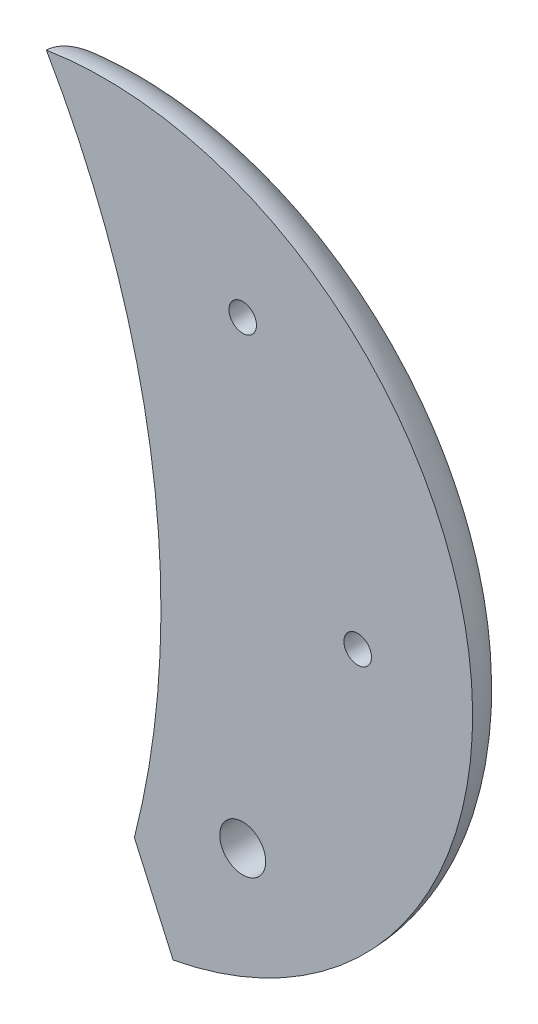
ISO-10303-21;
HEADER;
FILE_DESCRIPTION(('STEP AP214'),'2;1');
FILE_NAME('part.step','',(''),(''),'','','');
FILE_SCHEMA(('AUTOMOTIVE_DESIGN { 1 0 10303 214 1 1 1 1 }'));
ENDSEC;
DATA;
#1=APPLICATION_CONTEXT('core data for automotive mechanical design processes');
#2=APPLICATION_PROTOCOL_DEFINITION('international standard','automotive_design',2000,#1);
#3=PRODUCT_CONTEXT('',#1,'mechanical');
#4=PRODUCT('Part','Part','',(#3));
#5=PRODUCT_RELATED_PRODUCT_CATEGORY('part','',(#4));
#6=PRODUCT_DEFINITION_FORMATION('','',#4);
#7=PRODUCT_DEFINITION_CONTEXT('part definition',#1,'design');
#8=PRODUCT_DEFINITION('design','',#6,#7);
#9=PRODUCT_DEFINITION_SHAPE('','',#8);
#10=(LENGTH_UNIT() NAMED_UNIT(*) SI_UNIT(.MILLI.,.METRE.));
#11=(NAMED_UNIT(*) PLANE_ANGLE_UNIT() SI_UNIT($,.RADIAN.));
#12=(NAMED_UNIT(*) SI_UNIT($,.STERADIAN.) SOLID_ANGLE_UNIT());
#13=UNCERTAINTY_MEASURE_WITH_UNIT(LENGTH_MEASURE(1.E-05),#10,'distance_accuracy_value','');
#14=(GEOMETRIC_REPRESENTATION_CONTEXT(3) GLOBAL_UNCERTAINTY_ASSIGNED_CONTEXT((#13)) GLOBAL_UNIT_ASSIGNED_CONTEXT((#10,
#11,#12)) REPRESENTATION_CONTEXT('',''));
#15=CARTESIAN_POINT('',(0.,0.,0.));
#16=DIRECTION('',(0.,0.,1.));
#17=DIRECTION('',(1.,0.,0.));
#18=AXIS2_PLACEMENT_3D('',#15,#16,#17);
#19=CARTESIAN_POINT('',(0.,0.,5.));
#20=DIRECTION('',(0.,0.,1.));
#21=DIRECTION('',(1.,0.,0.));
#22=AXIS2_PLACEMENT_3D('',#19,#20,#21);
#23=PLANE('',#22);
#24=CARTESIAN_POINT('',(15.,-25.,5.));
#25=DIRECTION('',(0.,0.,1.));
#26=DIRECTION('',(1.,0.,0.));
#27=AXIS2_PLACEMENT_3D('',#24,#25,#26);
#28=CIRCLE('',#27,2.5);
#29=CARTESIAN_POINT('',(17.5,-25.,5.));
#30=VERTEX_POINT('',#29);
#31=EDGE_CURVE('E102',#30,#30,#28,.T.);
#32=ORIENTED_EDGE('',*,*,#31,.F.);
#33=EDGE_LOOP('',(#32));
#34=FACE_BOUND('',#33,.T.);
#35=CARTESIAN_POINT('',(27.5,0.,5.));
#36=DIRECTION('',(0.,0.,1.));
#37=DIRECTION('',(1.,0.,0.));
#38=AXIS2_PLACEMENT_3D('',#35,#36,#37);
#39=CIRCLE('',#38,1.5);
#40=CARTESIAN_POINT('',(29.,0.,5.));
#41=VERTEX_POINT('',#40);
#42=EDGE_CURVE('E161',#41,#41,#39,.T.);
#43=ORIENTED_EDGE('',*,*,#42,.F.);
#44=EDGE_LOOP('',(#43));
#45=FACE_BOUND('',#44,.T.);
#46=CARTESIAN_POINT('',(15.,25.,5.));
#47=DIRECTION('',(0.,0.,1.));
#48=DIRECTION('',(1.,0.,0.));
#49=AXIS2_PLACEMENT_3D('',#46,#47,#48);
#50=CIRCLE('',#49,1.5);
#51=CARTESIAN_POINT('',(16.5,25.,5.));
#52=VERTEX_POINT('',#51);
#53=EDGE_CURVE('E91',#52,#52,#50,.T.);
#54=ORIENTED_EDGE('',*,*,#53,.F.);
#55=EDGE_LOOP('',(#54));
#56=FACE_BOUND('',#55,.T.);
#57=CARTESIAN_POINT('',(-86.5413482702245,-6.91231837330547,5.));
#58=DIRECTION('',(0.,0.,1.));
#59=DIRECTION('',(1.,0.,0.));
#60=AXIS2_PLACEMENT_3D('',#57,#58,#59);
#61=CIRCLE('',#60,92.6509559360171);
#62=CARTESIAN_POINT('',(-6.34933432901625,39.4928595264812,5.));
#63=VERTEX_POINT('',#62);
#64=CARTESIAN_POINT('',(3.21960636714183,-29.872515638278,5.));
#65=VERTEX_POINT('',#64);
#66=EDGE_CURVE('E84',#63,#65,#61,.F.);
#67=ORIENTED_EDGE('',*,*,#66,.T.);
#68=DIRECTION('',(0.407955317687462,-0.913001894176853,0.));
#69=VECTOR('',#68,1.);
#70=CARTESIAN_POINT('',(-8.44266080544077,-3.77242193359996,5.));
#71=LINE('',#70,#69);
#72=CARTESIAN_POINT('',(7.4335131266519,-39.3032172041411,5.));
#73=VERTEX_POINT('',#72);
#74=EDGE_CURVE('E85',#65,#73,#71,.T.);
#75=ORIENTED_EDGE('',*,*,#74,.T.);
#76=CARTESIAN_POINT('',(0.,0.,5.));
#77=DIRECTION('',(0.,0.,1.));
#78=DIRECTION('',(1.,0.,0.));
#79=AXIS2_PLACEMENT_3D('',#76,#77,#78);
#80=CIRCLE('',#79,40.);
#81=EDGE_CURVE('E81',#73,#63,#80,.T.);
#82=ORIENTED_EDGE('',*,*,#81,.T.);
#83=EDGE_LOOP('',(#67,#75,#82));
#84=FACE_BOUND('',#83,.T.);
#85=ADVANCED_FACE('F37',(#34,#45,#56,#84),#23,.T.);
#86=CARTESIAN_POINT('',(0.,0.,0.));
#87=DIRECTION('',(0.,0.,1.));
#88=DIRECTION('',(1.,0.,0.));
#89=AXIS2_PLACEMENT_3D('',#86,#87,#88);
#90=PLANE('',#89);
#91=CARTESIAN_POINT('',(0.,0.,0.));
#92=DIRECTION('',(0.,0.,1.));
#93=DIRECTION('',(1.,0.,0.));
#94=AXIS2_PLACEMENT_3D('',#91,#92,#93);
#95=CIRCLE('',#94,35.);
#96=CARTESIAN_POINT('',(1.67675560083044,34.9598125088663,0.));
#97=VERTEX_POINT('',#96);
#98=CARTESIAN_POINT('',(10.2952692576855,-33.4515684372461,0.));
#99=VERTEX_POINT('',#98);
#100=EDGE_CURVE('E66',#97,#99,#95,.F.);
#101=ORIENTED_EDGE('',*,*,#100,.T.);
#102=DIRECTION('',(-0.407955317687462,0.913001894176853,0.));
#103=VECTOR('',#102,1.);
#104=CARTESIAN_POINT('',(7.7846158380261,-27.8327390498407,0.));
#105=LINE('',#104,#103);
#106=CARTESIAN_POINT('',(8.48499217786263,-29.4001776814344,0.));
#107=VERTEX_POINT('',#106);
#108=EDGE_CURVE('E11',#99,#107,#105,.T.);
#109=ORIENTED_EDGE('',*,*,#108,.T.);
#110=CARTESIAN_POINT('',(-86.5413482702245,-6.91231837330547,0.));
#111=DIRECTION('',(0.,0.,1.));
#112=DIRECTION('',(1.,0.,0.));
#113=AXIS2_PLACEMENT_3D('',#110,#111,#112);
#114=CIRCLE('',#113,97.6509559360171);
#115=EDGE_CURVE('E51',#107,#97,#114,.T.);
#116=ORIENTED_EDGE('',*,*,#115,.T.);
#117=EDGE_LOOP('',(#101,#109,#116));
#118=FACE_BOUND('',#117,.T.);
#119=CARTESIAN_POINT('',(15.,-25.,0.));
#120=DIRECTION('',(0.,0.,1.));
#121=DIRECTION('',(1.,0.,0.));
#122=AXIS2_PLACEMENT_3D('',#119,#120,#121);
#123=CIRCLE('',#122,2.5);
#124=CARTESIAN_POINT('',(17.5,-25.,0.));
#125=VERTEX_POINT('',#124);
#126=EDGE_CURVE('E87',#125,#125,#123,.T.);
#127=ORIENTED_EDGE('',*,*,#126,.T.);
#128=EDGE_LOOP('',(#127));
#129=FACE_BOUND('',#128,.T.);
#130=CARTESIAN_POINT('',(27.5,0.,0.));
#131=DIRECTION('',(0.,0.,1.));
#132=DIRECTION('',(1.,0.,0.));
#133=AXIS2_PLACEMENT_3D('',#130,#131,#132);
#134=CIRCLE('',#133,1.5);
#135=CARTESIAN_POINT('',(29.,0.,0.));
#136=VERTEX_POINT('',#135);
#137=EDGE_CURVE('E101',#136,#136,#134,.T.);
#138=ORIENTED_EDGE('',*,*,#137,.T.);
#139=EDGE_LOOP('',(#138));
#140=FACE_BOUND('',#139,.T.);
#141=CARTESIAN_POINT('',(15.,25.,0.));
#142=DIRECTION('',(0.,0.,1.));
#143=DIRECTION('',(1.,0.,0.));
#144=AXIS2_PLACEMENT_3D('',#141,#142,#143);
#145=CIRCLE('',#144,1.5);
#146=CARTESIAN_POINT('',(16.5,25.,0.));
#147=VERTEX_POINT('',#146);
#148=EDGE_CURVE('E98',#147,#147,#145,.T.);
#149=ORIENTED_EDGE('',*,*,#148,.T.);
#150=EDGE_LOOP('',(#149));
#151=FACE_BOUND('',#150,.T.);
#152=ADVANCED_FACE('F130',(#118,#129,#140,#151),#90,.F.);
#153=CARTESIAN_POINT('',(15.,25.,-5.));
#154=DIRECTION('',(0.,0.,1.));
#155=DIRECTION('',(1.,0.,0.));
#156=AXIS2_PLACEMENT_3D('',#153,#154,#155);
#157=CYLINDRICAL_SURFACE('',#156,1.5);
#158=ORIENTED_EDGE('',*,*,#53,.T.);
#159=EDGE_LOOP('',(#158));
#160=FACE_BOUND('',#159,.T.);
#161=ORIENTED_EDGE('',*,*,#148,.F.);
#162=EDGE_LOOP('',(#161));
#163=FACE_BOUND('',#162,.T.);
#164=ADVANCED_FACE('F136',(#160,#163),#157,.F.);
#165=CARTESIAN_POINT('',(27.5,0.,-5.));
#166=DIRECTION('',(0.,0.,1.));
#167=DIRECTION('',(1.,0.,0.));
#168=AXIS2_PLACEMENT_3D('',#165,#166,#167);
#169=CYLINDRICAL_SURFACE('',#168,1.5);
#170=ORIENTED_EDGE('',*,*,#42,.T.);
#171=EDGE_LOOP('',(#170));
#172=FACE_BOUND('',#171,.T.);
#173=ORIENTED_EDGE('',*,*,#137,.F.);
#174=EDGE_LOOP('',(#173));
#175=FACE_BOUND('',#174,.T.);
#176=ADVANCED_FACE('F142',(#172,#175),#169,.F.);
#177=CARTESIAN_POINT('',(15.,-25.,-5.));
#178=DIRECTION('',(0.,0.,1.));
#179=DIRECTION('',(1.,0.,0.));
#180=AXIS2_PLACEMENT_3D('',#177,#178,#179);
#181=CYLINDRICAL_SURFACE('',#180,2.5);
#182=ORIENTED_EDGE('',*,*,#31,.T.);
#183=EDGE_LOOP('',(#182));
#184=FACE_BOUND('',#183,.T.);
#185=ORIENTED_EDGE('',*,*,#126,.F.);
#186=EDGE_LOOP('',(#185));
#187=FACE_BOUND('',#186,.T.);
#188=ADVANCED_FACE('F128',(#184,#187),#181,.F.);
#189=CARTESIAN_POINT('',(0.,0.,5.));
#190=DIRECTION('',(0.,0.,1.));
#191=DIRECTION('',(1.,0.,0.));
#192=AXIS2_PLACEMENT_3D('',#189,#190,#191);
#193=TOROIDAL_SURFACE('',#192,35.,5.);
#194=CARTESIAN_POINT('',(7.4335131266519,-39.3032172041411,5.));
#195=CARTESIAN_POINT('',(7.43349706982536,-39.3032448814145,4.88114058274549));
#196=CARTESIAN_POINT('',(7.43601565029911,-39.2984316200717,4.76229415373771));
#197=CARTESIAN_POINT('',(7.44600232637123,-39.2793301524576,4.52563266454062));
#198=CARTESIAN_POINT('',(7.45346793519263,-39.2650467066656,4.40781711628032));
#199=CARTESIAN_POINT('',(7.47317035271472,-39.2273239566477,4.17479662335089));
#200=CARTESIAN_POINT('',(7.48537851495411,-39.2039396230162,4.0595803181668));
#201=CARTESIAN_POINT('',(7.51435263685935,-39.1483827738551,3.83187122514884));
#202=CARTESIAN_POINT('',(7.5311189499669,-39.1162095768309,3.71937864925152));
#203=CARTESIAN_POINT('',(7.56890413356768,-39.0436078314649,3.49807578904782));
#204=CARTESIAN_POINT('',(7.58991469897255,-39.0031954041135,3.38925879046831));
#205=CARTESIAN_POINT('',(7.63589506190757,-38.9146166819764,3.1756757916501));
#206=CARTESIAN_POINT('',(7.66086640164801,-38.8664473667723,3.07091138922122));
#207=CARTESIAN_POINT('',(7.74126128186387,-38.71108618888,2.76334704486396));
#208=CARTESIAN_POINT('',(7.80215621953385,-38.5930592132001,2.56733009358529));
#209=CARTESIAN_POINT('',(7.94030050240679,-38.3240347774547,2.18351012681306));
#210=CARTESIAN_POINT('',(8.01839682714232,-38.1713065471981,1.99724510539007));
#211=CARTESIAN_POINT('',(8.18474817590729,-37.8440541595943,1.65027076753012));
#212=CARTESIAN_POINT('',(8.27300781400306,-37.6695200994879,1.48957313796846));
#213=CARTESIAN_POINT('',(8.50198229121417,-37.2136945943499,1.12154723727595));
#214=CARTESIAN_POINT('',(8.64722625518886,-36.9219651476836,0.929897355823208));
#215=CARTESIAN_POINT('',(8.94697643685942,-36.3130001989014,0.601882206862391));
#216=CARTESIAN_POINT('',(9.10150306088673,-35.9957079374164,0.465644268173101));
#217=CARTESIAN_POINT('',(9.42880095302109,-35.3152367897644,0.235735339924001));
#218=CARTESIAN_POINT('',(9.60193684988345,-34.9505292546956,0.147172927620384));
#219=CARTESIAN_POINT('',(9.94732382431473,-34.2121967726328,0.0297041299798237));
#220=CARTESIAN_POINT('',(10.1195760140312,-33.8385935239971,0.000665158435207676));
#221=CARTESIAN_POINT('',(10.291358470693,-33.4601855696811,3.76785988373902E-06));
#222=CARTESIAN_POINT('',(10.2933140267177,-33.455877033049,2.39058509951097E-09));
#223=CARTESIAN_POINT('',(10.2952692576855,-33.4515684372461,0.));
#224=B_SPLINE_CURVE_WITH_KNOTS('',3,(#194,#195,#196,#197,#198,#199,#200,#201,#202,#203,#204,
#205,#206,#207,#208,#209,#210,#211,#212,#213,#214,#215,#216,#217,#218,#219,#220,#221,#222,#223),
.UNSPECIFIED.,.F.,.F.,(4,2,2,2,2,2,2,2,2,2,2,2,2,2,4),(0.,0.356433763450579,0.712688490217789,
1.06682397630559,1.4209869301036,1.77446346191828,2.12807796661644,2.83547857044468,
3.59244749983589,4.34976145236185,5.47777572386194,6.60836756478983,7.84363003278192,
9.0761379972164,9.09033268291981),.UNSPECIFIED.);
#225=EDGE_CURVE('E92',#99,#73,#224,.F.);
#226=ORIENTED_EDGE('',*,*,#225,.F.);
#227=ORIENTED_EDGE('',*,*,#100,.F.);
#228=CARTESIAN_POINT('',(-6.34933432901625,39.4928595264812,5.));
#229=CARTESIAN_POINT('',(-6.34938581211445,39.4928813010598,4.9003874473099));
#230=CARTESIAN_POINT('',(-6.34459357489191,39.4906079208942,4.80080858196663));
#231=CARTESIAN_POINT('',(-6.32572191810864,39.4816411014836,4.60287197031377));
#232=CARTESIAN_POINT('',(-6.31165555984538,39.4749538785019,4.50451270456445));
#233=CARTESIAN_POINT('',(-6.27487580933821,39.4574439359303,4.31115526180621));
#234=CARTESIAN_POINT('',(-6.25227783677624,39.4466764096558,4.21612995757361));
#235=CARTESIAN_POINT('',(-6.19908815519461,39.4212827948716,4.02888148330387));
#236=CARTESIAN_POINT('',(-6.16849423122525,39.4066556371989,3.93665909761422));
#237=CARTESIAN_POINT('',(-6.06622341149592,39.3576415285459,3.66616080715771));
#238=CARTESIAN_POINT('',(-5.98380540920679,39.3180029365712,3.4928108185561));
#239=CARTESIAN_POINT('',(-5.79639640285722,39.2272586303197,3.16159033794285));
#240=CARTESIAN_POINT('',(-5.6913216958957,39.1761103633101,3.00378049470395));
#241=CARTESIAN_POINT('',(-5.48862859533805,39.0766714012802,2.73639233411415));
#242=CARTESIAN_POINT('',(-5.39419726962251,39.0300967139259,2.62370452026747));
#243=CARTESIAN_POINT('',(-5.19706554814941,38.9322337413008,2.40795978244989));
#244=CARTESIAN_POINT('',(-5.09436089600701,38.8809430278284,2.30490787554221));
#245=CARTESIAN_POINT('',(-4.88239658574451,38.7743534244096,2.10787947212102));
#246=CARTESIAN_POINT('',(-4.77313132623927,38.7190511007579,2.01391091477147));
#247=CARTESIAN_POINT('',(-4.54946812595449,38.6050279593011,1.83451406864182));
#248=CARTESIAN_POINT('',(-4.4350683671019,38.5463059283881,1.74908884008642));
#249=CARTESIAN_POINT('',(-4.12496623852048,38.3859312338829,1.53211883171649));
#250=CARTESIAN_POINT('',(-3.92569512058059,38.2816519147062,1.40759313476817));
#251=CARTESIAN_POINT('',(-3.51973127832814,38.0664060918535,1.17804712493413));
#252=CARTESIAN_POINT('',(-3.31303564323228,37.9554369536084,1.07303456401019));
#253=CARTESIAN_POINT('',(-2.89529324849806,37.7281358762813,0.880676843464034));
#254=CARTESIAN_POINT('',(-2.6842589692131,37.6118183788248,0.793287185074651));
#255=CARTESIAN_POINT('',(-2.25906333718015,37.374256167364,0.634112853646358));
#256=CARTESIAN_POINT('',(-2.04490106250636,37.2530099811352,0.562332884564124));
#257=CARTESIAN_POINT('',(-1.61504629090967,37.006289351899,0.433090524636979));
#258=CARTESIAN_POINT('',(-1.39935562420495,36.8808194536264,0.375613269900267));
#259=CARTESIAN_POINT('',(-0.967262339636559,36.6259750592354,0.273781984095831));
#260=CARTESIAN_POINT('',(-0.750859823192038,36.4966010995513,0.229426159055126));
#261=CARTESIAN_POINT('',(-0.167157450372469,36.1427687904731,0.126226675226711));
#262=CARTESIAN_POINT('',(0.200139627692817,35.9149147640757,0.0788485052459696));
#263=CARTESIAN_POINT('',(0.933970256808445,35.4487612192447,0.0158129418058428));
#264=CARTESIAN_POINT('',(1.30048504991167,35.2104058335758,0.000353461625820038));
#265=CARTESIAN_POINT('',(1.66840027063927,34.9653793165677,2.00220007346211E-06));
#266=CARTESIAN_POINT('',(1.67257811994305,34.9625961687498,4.88181453163267E-09));
#267=CARTESIAN_POINT('',(1.67675560083044,34.9598125088663,0.));
#268=B_SPLINE_CURVE_WITH_KNOTS('',3,(#228,#229,#230,#231,#232,#233,#234,#235,#236,#237,#238,
#239,#240,#241,#242,#243,#244,#245,#246,#247,#248,#249,#250,#251,#252,#253,#254,#255,#256,#257,
#258,#259,#260,#261,#262,#263,#264,#265,#266,#267),.UNSPECIFIED.,.F.,.F.,(4,2,2,2,2,2,2,2,2,2,2,
2,2,2,2,2,2,2,2,4),(0.,0.298642413881457,0.596865127722299,0.891190068590141,1.18559662665874,
1.77064547103983,2.35789392870877,2.81993059170043,3.28220649608892,3.74488286000244,
4.20772436565411,4.97774698927387,5.74807486794805,6.51643257663012,7.28502150889169,
8.0528083285726,8.82049012722231,10.1234901000428,11.4345454115449,11.4496053916506),.UNSPECIFIED.);
#269=EDGE_CURVE('E42',#63,#97,#268,.T.);
#270=ORIENTED_EDGE('',*,*,#269,.F.);
#271=ORIENTED_EDGE('',*,*,#81,.F.);
#272=EDGE_LOOP('',(#226,#227,#270,#271));
#273=FACE_BOUND('',#272,.T.);
#274=ADVANCED_FACE('F39',(#273),#193,.T.);
#275=CARTESIAN_POINT('',(-86.5413482702245,-6.91231837330547,5.));
#276=DIRECTION('',(0.,0.,1.));
#277=DIRECTION('',(1.,0.,0.));
#278=AXIS2_PLACEMENT_3D('',#275,#276,#277);
#279=TOROIDAL_SURFACE('',#278,97.6509559360171,5.);
#280=ORIENTED_EDGE('',*,*,#269,.T.);
#281=ORIENTED_EDGE('',*,*,#115,.F.);
#282=CARTESIAN_POINT('',(3.21960636714183,-29.872515638278,5.));
#283=CARTESIAN_POINT('',(3.21958631821189,-29.8725169679784,4.86498295678988));
#284=CARTESIAN_POINT('',(3.22537605525363,-29.8720246286172,4.72997104537992));
#285=CARTESIAN_POINT('',(3.24842841896875,-29.8700623649638,4.46095883307532));
#286=CARTESIAN_POINT('',(3.26568916651088,-29.8685926007893,4.3269583701252));
#287=CARTESIAN_POINT('',(3.3114856310401,-29.8646896091118,4.06122335822425));
#288=CARTESIAN_POINT('',(3.33999601691119,-29.8622585461654,3.9294844076629));
#289=CARTESIAN_POINT('',(3.40801449671376,-29.8564513754615,3.66889913024041));
#290=CARTESIAN_POINT('',(3.44752270389293,-29.8530752579726,3.54005283318051));
#291=CARTESIAN_POINT('',(3.53715666000715,-29.8454036312991,3.28618367114225));
#292=CARTESIAN_POINT('',(3.58727914103457,-29.8411084050843,3.16115964289584));
#293=CARTESIAN_POINT('',(3.69771640664684,-29.8316266510663,2.91568040702171));
#294=CARTESIAN_POINT('',(3.75803495820071,-29.8264397938352,2.79522690820285));
#295=CARTESIAN_POINT('',(3.88831555119344,-29.8152124194777,2.55972674628342));
#296=CARTESIAN_POINT('',(3.95827584196064,-29.809172057319,2.44467910670285));
#297=CARTESIAN_POINT('',(4.10728971800427,-29.7962748048979,2.2206251951008));
#298=CARTESIAN_POINT('',(4.18634673008866,-29.7894176068924,2.11162122284211));
#299=CARTESIAN_POINT('',(4.35486091297415,-29.7747619008362,1.89784998636964));
#300=CARTESIAN_POINT('',(4.44451806327124,-29.7669451297243,1.79324141392402));
#301=CARTESIAN_POINT('',(4.63196993176155,-29.7505536532528,1.59163155992706));
#302=CARTESIAN_POINT('',(4.72976761941572,-29.7419786712455,1.49463307962831));
#303=CARTESIAN_POINT('',(5.03426591771329,-29.7151951872126,1.21589788738686));
#304=CARTESIAN_POINT('',(5.25218888769944,-29.6959179924184,1.04627376432797));
#305=CARTESIAN_POINT('',(5.72354679362503,-29.6539229904917,0.735135024032241));
#306=CARTESIAN_POINT('',(5.97824715761417,-29.6310774932219,0.595569880751988));
#307=CARTESIAN_POINT('',(6.50658828311783,-29.5833114934415,0.359015465709663));
#308=CARTESIAN_POINT('',(6.78023070938695,-29.5583908085104,0.26202994164202));
#309=CARTESIAN_POINT('',(7.28913762494475,-29.51167241529,0.125780963323994));
#310=CARTESIAN_POINT('',(7.52253885612927,-29.4901107840576,0.0793063012245801));
#311=CARTESIAN_POINT('',(7.99302017465318,-29.4463644518724,0.0168490488652886));
#312=CARTESIAN_POINT('',(8.23009190133318,-29.4241810939659,0.00080520510441668));
#313=CARTESIAN_POINT('',(8.47294685581575,-29.4013122241444,9.82582413837984E-06));
#314=CARTESIAN_POINT('',(8.47896961332682,-29.4007449893026,-2.53356205745591E-08));
#315=CARTESIAN_POINT('',(8.48499217786264,-29.4001776814344,0.));
#316=B_SPLINE_CURVE_WITH_KNOTS('',3,(#282,#283,#284,#285,#286,#287,#288,#289,#290,#291,#292,
#293,#294,#295,#296,#297,#298,#299,#300,#301,#302,#303,#304,#305,#306,#307,#308,#309,#310,#311,
#312,#313,#314,#315),.UNSPECIFIED.,.F.,.F.,(4,2,2,2,2,2,2,2,2,2,2,2,2,2,2,2,4),(0.,
0.404918355803446,0.809770395980637,1.21371597496438,1.61766571364457,2.0214912651945,
2.42546633870873,2.82936815798828,3.23342263155255,3.64692620603185,4.06058128271161,
4.88733172174989,5.7575981002727,6.62794106094864,7.34300330905304,8.0566246908282,
8.07477290727454),.UNSPECIFIED.);
#317=EDGE_CURVE('E59',#65,#107,#316,.T.);
#318=ORIENTED_EDGE('',*,*,#317,.F.);
#319=ORIENTED_EDGE('',*,*,#66,.F.);
#320=EDGE_LOOP('',(#280,#281,#318,#319));
#321=FACE_BOUND('',#320,.T.);
#322=ADVANCED_FACE('F93',(#321),#279,.T.);
#323=CARTESIAN_POINT('',(-3.8776513345565,-1.73264534516265,5.));
#324=DIRECTION('',(0.407955317687462,-0.913001894176853,0.));
#325=DIRECTION('',(0.913001894176853,0.407955317687462,0.));
#326=AXIS2_PLACEMENT_3D('',#323,#324,#325);
#327=CYLINDRICAL_SURFACE('',#326,5.);
#328=ORIENTED_EDGE('',*,*,#225,.T.);
#329=ORIENTED_EDGE('',*,*,#74,.F.);
#330=ORIENTED_EDGE('',*,*,#317,.T.);
#331=ORIENTED_EDGE('',*,*,#108,.F.);
#332=EDGE_LOOP('',(#328,#329,#330,#331));
#333=FACE_BOUND('',#332,.T.);
#334=ADVANCED_FACE('F118',(#333),#327,.T.);
#335=CLOSED_SHELL('',(#85,#152,#164,#176,#188,#274,#322,#334));
#336=MANIFOLD_SOLID_BREP('B2',#335);
#337=ADVANCED_BREP_SHAPE_REPRESENTATION('',(#18,#336),#14);
#338=SHAPE_DEFINITION_REPRESENTATION(#9,#337);
ENDSEC;
END-ISO-10303-21;
